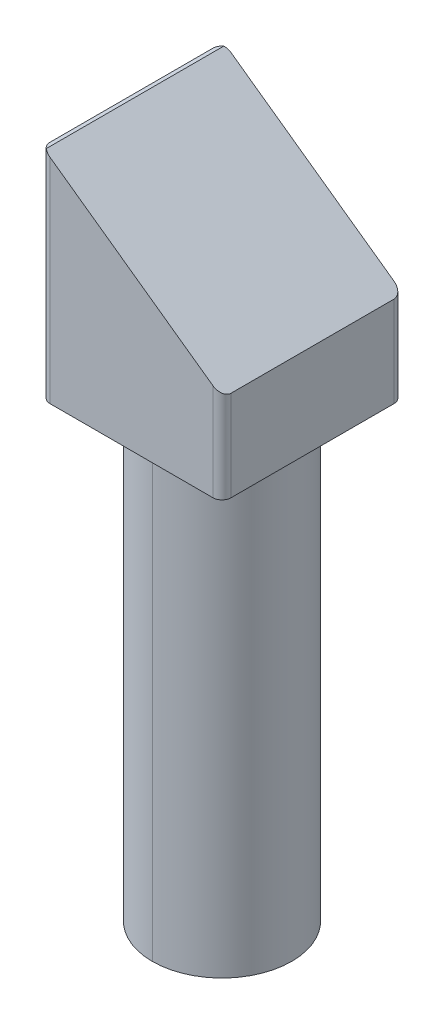
ISO-10303-21;
HEADER;
FILE_DESCRIPTION(('STEP AP214'),'2;1');
FILE_NAME('part.step','',(''),(''),'','','');
FILE_SCHEMA(('AUTOMOTIVE_DESIGN { 1 0 10303 214 1 1 1 1 }'));
ENDSEC;
DATA;
#1=APPLICATION_CONTEXT('core data for automotive mechanical design processes');
#2=APPLICATION_PROTOCOL_DEFINITION('international standard','automotive_design',2000,#1);
#3=PRODUCT_CONTEXT('',#1,'mechanical');
#4=PRODUCT('Part','Part','',(#3));
#5=PRODUCT_RELATED_PRODUCT_CATEGORY('part','',(#4));
#6=PRODUCT_DEFINITION_FORMATION('','',#4);
#7=PRODUCT_DEFINITION_CONTEXT('part definition',#1,'design');
#8=PRODUCT_DEFINITION('design','',#6,#7);
#9=PRODUCT_DEFINITION_SHAPE('','',#8);
#10=(LENGTH_UNIT() NAMED_UNIT(*) SI_UNIT(.MILLI.,.METRE.));
#11=(NAMED_UNIT(*) PLANE_ANGLE_UNIT() SI_UNIT($,.RADIAN.));
#12=(NAMED_UNIT(*) SI_UNIT($,.STERADIAN.) SOLID_ANGLE_UNIT());
#13=UNCERTAINTY_MEASURE_WITH_UNIT(LENGTH_MEASURE(1.E-05),#10,'distance_accuracy_value','');
#14=(GEOMETRIC_REPRESENTATION_CONTEXT(3) GLOBAL_UNCERTAINTY_ASSIGNED_CONTEXT((#13)) GLOBAL_UNIT_ASSIGNED_CONTEXT((#10,
#11,#12)) REPRESENTATION_CONTEXT('',''));
#15=CARTESIAN_POINT('',(0.,0.,0.));
#16=DIRECTION('',(0.,0.,1.));
#17=DIRECTION('',(1.,0.,0.));
#18=AXIS2_PLACEMENT_3D('',#15,#16,#17);
#19=CARTESIAN_POINT('',(0.,12.,0.));
#20=DIRECTION('',(0.,-1.,0.));
#21=DIRECTION('',(0.,0.,-1.));
#22=AXIS2_PLACEMENT_3D('',#19,#20,#21);
#23=PLANE('',#22);
#24=CARTESIAN_POINT('',(-4.5,12.,-4.5));
#25=DIRECTION('',(0.,-1.,0.));
#26=DIRECTION('',(0.,0.,-1.));
#27=AXIS2_PLACEMENT_3D('',#24,#25,#26);
#28=CIRCLE('',#27,0.5);
#29=CARTESIAN_POINT('',(-5.,12.,-4.5));
#30=VERTEX_POINT('',#29);
#31=CARTESIAN_POINT('',(-4.8,12.,-4.9));
#32=VERTEX_POINT('',#31);
#33=EDGE_CURVE('E11',#30,#32,#28,.T.);
#34=ORIENTED_EDGE('',*,*,#33,.F.);
#35=DIRECTION('',(0.,0.,1.));
#36=VECTOR('',#35,1.);
#37=CARTESIAN_POINT('',(-5.,12.,5.));
#38=LINE('',#37,#36);
#39=CARTESIAN_POINT('',(-5.,12.,4.5));
#40=VERTEX_POINT('',#39);
#41=EDGE_CURVE('E161',#30,#40,#38,.T.);
#42=ORIENTED_EDGE('',*,*,#41,.T.);
#43=CARTESIAN_POINT('',(-4.5,12.,4.5));
#44=DIRECTION('',(0.,-1.,0.));
#45=DIRECTION('',(0.,0.,-1.));
#46=AXIS2_PLACEMENT_3D('',#43,#44,#45);
#47=CIRCLE('',#46,0.5);
#48=CARTESIAN_POINT('',(-4.8,12.,4.9));
#49=VERTEX_POINT('',#48);
#50=EDGE_CURVE('E27',#49,#40,#47,.T.);
#51=ORIENTED_EDGE('',*,*,#50,.F.);
#52=DIRECTION('',(0.,0.,-1.));
#53=VECTOR('',#52,1.);
#54=CARTESIAN_POINT('',(-4.8,12.,-7.));
#55=LINE('',#54,#53);
#56=EDGE_CURVE('E219',#49,#32,#55,.T.);
#57=ORIENTED_EDGE('',*,*,#56,.T.);
#58=EDGE_LOOP('',(#34,#42,#51,#57));
#59=FACE_BOUND('',#58,.T.);
#60=ADVANCED_FACE('F16',(#59),#23,.F.);
#61=CARTESIAN_POINT('',(-4.5,12.,-4.5));
#62=DIRECTION('',(0.,-1.,0.));
#63=DIRECTION('',(0.,0.,-1.));
#64=AXIS2_PLACEMENT_3D('',#61,#62,#63);
#65=CYLINDRICAL_SURFACE('',#64,0.5);
#66=DIRECTION('',(0.,1.,0.));
#67=VECTOR('',#66,1.);
#68=CARTESIAN_POINT('',(-5.,12.,-4.5));
#69=LINE('',#68,#67);
#70=CARTESIAN_POINT('',(-5.,0.,-4.5));
#71=VERTEX_POINT('',#70);
#72=EDGE_CURVE('E162',#71,#30,#69,.T.);
#73=ORIENTED_EDGE('',*,*,#72,.T.);
#74=ORIENTED_EDGE('',*,*,#33,.T.);
#75=CARTESIAN_POINT('',(-4.8,12.,-4.9));
#76=CARTESIAN_POINT('',(-4.71268546646672,11.9376324760477,-4.96548590014996));
#77=CARTESIAN_POINT('',(-4.6091431669166,11.8636736906547,-5.));
#78=CARTESIAN_POINT('',(-4.5,11.7857142857143,-5.));
#79=(BOUNDED_CURVE() B_SPLINE_CURVE(3,(#75,#76,#77,#78),.UNSPECIFIED.,.F.,
.F.) B_SPLINE_CURVE_WITH_KNOTS((4,4),(4.06888787159142,4.71238898038469),
.UNSPECIFIED.) CURVE() GEOMETRIC_REPRESENTATION_ITEM() RATIONAL_B_SPLINE_CURVE((1.,
0.96578886536701,0.96578886536701,1.)) REPRESENTATION_ITEM(''));
#80=CARTESIAN_POINT('',(-4.5,11.7857142857143,-5.));
#81=VERTEX_POINT('',#80);
#82=EDGE_CURVE('E206',#32,#81,#79,.T.);
#83=ORIENTED_EDGE('',*,*,#82,.T.);
#84=DIRECTION('',(0.,-1.,0.));
#85=VECTOR('',#84,1.);
#86=CARTESIAN_POINT('',(-4.5,12.,-5.));
#87=LINE('',#86,#85);
#88=CARTESIAN_POINT('',(-4.5,0.,-5.));
#89=VERTEX_POINT('',#88);
#90=EDGE_CURVE('E250',#81,#89,#87,.T.);
#91=ORIENTED_EDGE('',*,*,#90,.T.);
#92=CARTESIAN_POINT('',(-4.5,0.,-4.5));
#93=DIRECTION('',(0.,1.,0.));
#94=DIRECTION('',(0.,0.,-1.));
#95=AXIS2_PLACEMENT_3D('',#92,#93,#94);
#96=CIRCLE('',#95,0.5);
#97=EDGE_CURVE('E172',#89,#71,#96,.T.);
#98=ORIENTED_EDGE('',*,*,#97,.T.);
#99=EDGE_LOOP('',(#73,#74,#83,#91,#98));
#100=FACE_BOUND('',#99,.T.);
#101=ADVANCED_FACE('F424',(#100),#65,.T.);
#102=CARTESIAN_POINT('',(4.5,12.,-4.5));
#103=DIRECTION('',(0.,-1.,0.));
#104=DIRECTION('',(0.,0.,-1.));
#105=AXIS2_PLACEMENT_3D('',#102,#103,#104);
#106=CYLINDRICAL_SURFACE('',#105,0.5);
#107=CARTESIAN_POINT('',(4.5,0.,-4.5));
#108=DIRECTION('',(0.,1.,0.));
#109=DIRECTION('',(0.,0.,-1.));
#110=AXIS2_PLACEMENT_3D('',#107,#108,#109);
#111=CIRCLE('',#110,0.5);
#112=CARTESIAN_POINT('',(5.,0.,-4.5));
#113=VERTEX_POINT('',#112);
#114=CARTESIAN_POINT('',(4.5,0.,-5.));
#115=VERTEX_POINT('',#114);
#116=EDGE_CURVE('E259',#113,#115,#111,.T.);
#117=ORIENTED_EDGE('',*,*,#116,.T.);
#118=DIRECTION('',(0.,1.,0.));
#119=VECTOR('',#118,1.);
#120=CARTESIAN_POINT('',(4.5,12.,-5.));
#121=LINE('',#120,#119);
#122=CARTESIAN_POINT('',(4.5,5.35714285714286,-5.));
#123=VERTEX_POINT('',#122);
#124=EDGE_CURVE('E256',#115,#123,#121,.T.);
#125=ORIENTED_EDGE('',*,*,#124,.T.);
#126=CARTESIAN_POINT('',(4.5,5.35714285714286,-5.));
#127=CARTESIAN_POINT('',(4.79289321881345,5.14793341513324,-5.));
#128=CARTESIAN_POINT('',(5.,5.,-4.79289321881345));
#129=CARTESIAN_POINT('',(5.,5.,-4.5));
#130=(BOUNDED_CURVE() B_SPLINE_CURVE(3,(#126,#127,#128,#129),.UNSPECIFIED.,.F.,
.F.) B_SPLINE_CURVE_WITH_KNOTS((4,4),(4.71238898038469,6.28318530717958),
.UNSPECIFIED.) CURVE() GEOMETRIC_REPRESENTATION_ITEM() RATIONAL_B_SPLINE_CURVE((1.,
0.804737854124365,0.804737854124365,1.)) REPRESENTATION_ITEM(''));
#131=CARTESIAN_POINT('',(5.,5.,-4.5));
#132=VERTEX_POINT('',#131);
#133=EDGE_CURVE('E189',#123,#132,#130,.T.);
#134=ORIENTED_EDGE('',*,*,#133,.T.);
#135=DIRECTION('',(0.,-1.,0.));
#136=VECTOR('',#135,1.);
#137=CARTESIAN_POINT('',(5.,12.,-4.5));
#138=LINE('',#137,#136);
#139=EDGE_CURVE('E194',#132,#113,#138,.T.);
#140=ORIENTED_EDGE('',*,*,#139,.T.);
#141=EDGE_LOOP('',(#117,#125,#134,#140));
#142=FACE_BOUND('',#141,.T.);
#143=ADVANCED_FACE('F328',(#142),#106,.T.);
#144=CARTESIAN_POINT('',(-4.5,12.,4.5));
#145=DIRECTION('',(0.,-1.,0.));
#146=DIRECTION('',(0.,0.,-1.));
#147=AXIS2_PLACEMENT_3D('',#144,#145,#146);
#148=CYLINDRICAL_SURFACE('',#147,0.5);
#149=DIRECTION('',(0.,1.,0.));
#150=VECTOR('',#149,1.);
#151=CARTESIAN_POINT('',(-4.5,12.,5.));
#152=LINE('',#151,#150);
#153=CARTESIAN_POINT('',(-4.5,0.,5.));
#154=VERTEX_POINT('',#153);
#155=CARTESIAN_POINT('',(-4.5,11.7857142857143,5.));
#156=VERTEX_POINT('',#155);
#157=EDGE_CURVE('E198',#154,#156,#152,.T.);
#158=ORIENTED_EDGE('',*,*,#157,.T.);
#159=CARTESIAN_POINT('',(-4.5,11.7857142857143,5.));
#160=CARTESIAN_POINT('',(-4.6091431669166,11.8636736906547,5.));
#161=CARTESIAN_POINT('',(-4.71268546646672,11.9376324760477,4.96548590014996));
#162=CARTESIAN_POINT('',(-4.8,12.,4.9));
#163=(BOUNDED_CURVE() B_SPLINE_CURVE(3,(#159,#160,#161,#162),.UNSPECIFIED.,.F.,
.F.) B_SPLINE_CURVE_WITH_KNOTS((4,4),(1.5707963267949,2.21429743558817),
.UNSPECIFIED.) CURVE() GEOMETRIC_REPRESENTATION_ITEM() RATIONAL_B_SPLINE_CURVE((1.,
0.96578886536701,0.96578886536701,1.)) REPRESENTATION_ITEM(''));
#164=EDGE_CURVE('E299',#156,#49,#163,.T.);
#165=ORIENTED_EDGE('',*,*,#164,.T.);
#166=ORIENTED_EDGE('',*,*,#50,.T.);
#167=DIRECTION('',(0.,-1.,0.));
#168=VECTOR('',#167,1.);
#169=CARTESIAN_POINT('',(-5.,12.,4.5));
#170=LINE('',#169,#168);
#171=CARTESIAN_POINT('',(-5.,0.,4.5));
#172=VERTEX_POINT('',#171);
#173=EDGE_CURVE('E151',#40,#172,#170,.T.);
#174=ORIENTED_EDGE('',*,*,#173,.T.);
#175=CARTESIAN_POINT('',(-4.5,0.,4.5));
#176=DIRECTION('',(0.,1.,0.));
#177=DIRECTION('',(0.,0.,-1.));
#178=AXIS2_PLACEMENT_3D('',#175,#176,#177);
#179=CIRCLE('',#178,0.5);
#180=EDGE_CURVE('E156',#172,#154,#179,.T.);
#181=ORIENTED_EDGE('',*,*,#180,.T.);
#182=EDGE_LOOP('',(#158,#165,#166,#174,#181));
#183=FACE_BOUND('',#182,.T.);
#184=ADVANCED_FACE('F154',(#183),#148,.T.);
#185=CARTESIAN_POINT('',(5.,5.,-7.));
#186=DIRECTION('',(-0.581238193719097,-0.813733471206735,0.));
#187=DIRECTION('',(-0.813733471206735,0.581238193719097,0.));
#188=AXIS2_PLACEMENT_3D('',#185,#186,#187);
#189=PLANE('',#188);
#190=ORIENTED_EDGE('',*,*,#82,.F.);
#191=ORIENTED_EDGE('',*,*,#56,.F.);
#192=ORIENTED_EDGE('',*,*,#164,.F.);
#193=DIRECTION('',(0.813733471206735,-0.581238193719096,0.));
#194=VECTOR('',#193,1.);
#195=CARTESIAN_POINT('',(-4.5,11.7857142857143,5.));
#196=LINE('',#195,#194);
#197=CARTESIAN_POINT('',(4.5,5.35714285714286,5.));
#198=VERTEX_POINT('',#197);
#199=EDGE_CURVE('E207',#156,#198,#196,.T.);
#200=ORIENTED_EDGE('',*,*,#199,.T.);
#201=CARTESIAN_POINT('',(5.,5.,4.5));
#202=CARTESIAN_POINT('',(5.,5.,4.79289321881345));
#203=CARTESIAN_POINT('',(4.79289321881345,5.14793341513324,5.));
#204=CARTESIAN_POINT('',(4.5,5.35714285714286,5.));
#205=(BOUNDED_CURVE() B_SPLINE_CURVE(3,(#201,#202,#203,#204),.UNSPECIFIED.,.F.,
.F.) B_SPLINE_CURVE_WITH_KNOTS((4,4),(0.,1.5707963267949),
.UNSPECIFIED.) CURVE() GEOMETRIC_REPRESENTATION_ITEM() RATIONAL_B_SPLINE_CURVE((1.,
0.804737854124365,0.804737854124365,1.)) REPRESENTATION_ITEM(''));
#206=CARTESIAN_POINT('',(5.,5.,4.5));
#207=VERTEX_POINT('',#206);
#208=EDGE_CURVE('E201',#207,#198,#205,.T.);
#209=ORIENTED_EDGE('',*,*,#208,.F.);
#210=DIRECTION('',(0.,0.,-1.));
#211=VECTOR('',#210,1.);
#212=CARTESIAN_POINT('',(5.,5.,5.));
#213=LINE('',#212,#211);
#214=EDGE_CURVE('E197',#207,#132,#213,.T.);
#215=ORIENTED_EDGE('',*,*,#214,.T.);
#216=ORIENTED_EDGE('',*,*,#133,.F.);
#217=DIRECTION('',(-0.813733471206735,0.581238193719096,0.));
#218=VECTOR('',#217,1.);
#219=CARTESIAN_POINT('',(4.5,5.35714285714286,-5.));
#220=LINE('',#219,#218);
#221=EDGE_CURVE('E254',#123,#81,#220,.T.);
#222=ORIENTED_EDGE('',*,*,#221,.T.);
#223=EDGE_LOOP('',(#190,#191,#192,#200,#209,#215,#216,#222));
#224=FACE_BOUND('',#223,.T.);
#225=ADVANCED_FACE('F406',(#224),#189,.F.);
#226=CARTESIAN_POINT('',(4.5,12.,4.5));
#227=DIRECTION('',(0.,-1.,0.));
#228=DIRECTION('',(0.,0.,-1.));
#229=AXIS2_PLACEMENT_3D('',#226,#227,#228);
#230=CYLINDRICAL_SURFACE('',#229,0.5);
#231=CARTESIAN_POINT('',(4.5,0.,4.5));
#232=DIRECTION('',(0.,1.,0.));
#233=DIRECTION('',(0.,0.,-1.));
#234=AXIS2_PLACEMENT_3D('',#231,#232,#233);
#235=CIRCLE('',#234,0.5);
#236=CARTESIAN_POINT('',(4.5,0.,5.));
#237=VERTEX_POINT('',#236);
#238=CARTESIAN_POINT('',(5.,0.,4.5));
#239=VERTEX_POINT('',#238);
#240=EDGE_CURVE('E272',#237,#239,#235,.T.);
#241=ORIENTED_EDGE('',*,*,#240,.T.);
#242=DIRECTION('',(0.,1.,0.));
#243=VECTOR('',#242,1.);
#244=CARTESIAN_POINT('',(5.,12.,4.5));
#245=LINE('',#244,#243);
#246=EDGE_CURVE('E255',#239,#207,#245,.T.);
#247=ORIENTED_EDGE('',*,*,#246,.T.);
#248=ORIENTED_EDGE('',*,*,#208,.T.);
#249=DIRECTION('',(0.,-1.,0.));
#250=VECTOR('',#249,1.);
#251=CARTESIAN_POINT('',(4.5,12.,5.));
#252=LINE('',#251,#250);
#253=EDGE_CURVE('E214',#198,#237,#252,.T.);
#254=ORIENTED_EDGE('',*,*,#253,.T.);
#255=EDGE_LOOP('',(#241,#247,#248,#254));
#256=FACE_BOUND('',#255,.T.);
#257=ADVANCED_FACE('F324',(#256),#230,.T.);
#258=CARTESIAN_POINT('',(-5.,12.,5.));
#259=DIRECTION('',(1.,0.,0.));
#260=DIRECTION('',(0.,1.,0.));
#261=AXIS2_PLACEMENT_3D('',#258,#259,#260);
#262=PLANE('',#261);
#263=ORIENTED_EDGE('',*,*,#72,.F.);
#264=DIRECTION('',(0.,0.,-1.));
#265=VECTOR('',#264,1.);
#266=CARTESIAN_POINT('',(-5.,0.,0.));
#267=LINE('',#266,#265);
#268=EDGE_CURVE('E165',#172,#71,#267,.T.);
#269=ORIENTED_EDGE('',*,*,#268,.F.);
#270=ORIENTED_EDGE('',*,*,#173,.F.);
#271=ORIENTED_EDGE('',*,*,#41,.F.);
#272=EDGE_LOOP('',(#263,#269,#270,#271));
#273=FACE_BOUND('',#272,.T.);
#274=ADVANCED_FACE('F166',(#273),#262,.F.);
#275=CARTESIAN_POINT('',(-5.,12.,-5.));
#276=DIRECTION('',(0.,0.,1.));
#277=DIRECTION('',(1.,0.,0.));
#278=AXIS2_PLACEMENT_3D('',#275,#276,#277);
#279=PLANE('',#278);
#280=ORIENTED_EDGE('',*,*,#90,.F.);
#281=ORIENTED_EDGE('',*,*,#221,.F.);
#282=ORIENTED_EDGE('',*,*,#124,.F.);
#283=DIRECTION('',(1.,0.,0.));
#284=VECTOR('',#283,1.);
#285=CARTESIAN_POINT('',(0.,0.,-5.));
#286=LINE('',#285,#284);
#287=EDGE_CURVE('E263',#89,#115,#286,.T.);
#288=ORIENTED_EDGE('',*,*,#287,.F.);
#289=EDGE_LOOP('',(#280,#281,#282,#288));
#290=FACE_BOUND('',#289,.T.);
#291=ADVANCED_FACE('F436',(#290),#279,.F.);
#292=CARTESIAN_POINT('',(5.,12.,5.));
#293=DIRECTION('',(-1.,0.,0.));
#294=DIRECTION('',(0.,0.,1.));
#295=AXIS2_PLACEMENT_3D('',#292,#293,#294);
#296=PLANE('',#295);
#297=ORIENTED_EDGE('',*,*,#139,.F.);
#298=ORIENTED_EDGE('',*,*,#214,.F.);
#299=ORIENTED_EDGE('',*,*,#246,.F.);
#300=DIRECTION('',(0.,0.,1.));
#301=VECTOR('',#300,1.);
#302=CARTESIAN_POINT('',(5.,0.,0.));
#303=LINE('',#302,#301);
#304=EDGE_CURVE('E262',#113,#239,#303,.T.);
#305=ORIENTED_EDGE('',*,*,#304,.F.);
#306=EDGE_LOOP('',(#297,#298,#299,#305));
#307=FACE_BOUND('',#306,.T.);
#308=ADVANCED_FACE('F327',(#307),#296,.F.);
#309=CARTESIAN_POINT('',(-5.,12.,5.));
#310=DIRECTION('',(0.,0.,-1.));
#311=DIRECTION('',(0.,-1.,0.));
#312=AXIS2_PLACEMENT_3D('',#309,#310,#311);
#313=PLANE('',#312);
#314=ORIENTED_EDGE('',*,*,#253,.F.);
#315=ORIENTED_EDGE('',*,*,#199,.F.);
#316=ORIENTED_EDGE('',*,*,#157,.F.);
#317=DIRECTION('',(-1.,0.,0.));
#318=VECTOR('',#317,1.);
#319=CARTESIAN_POINT('',(0.,0.,5.));
#320=LINE('',#319,#318);
#321=EDGE_CURVE('E177',#237,#154,#320,.T.);
#322=ORIENTED_EDGE('',*,*,#321,.F.);
#323=EDGE_LOOP('',(#314,#315,#316,#322));
#324=FACE_BOUND('',#323,.T.);
#325=ADVANCED_FACE('F418',(#324),#313,.F.);
#326=CARTESIAN_POINT('',(0.,0.,0.));
#327=DIRECTION('',(0.,-1.,0.));
#328=DIRECTION('',(0.,0.,-1.));
#329=AXIS2_PLACEMENT_3D('',#326,#327,#328);
#330=PLANE('',#329);
#331=CARTESIAN_POINT('',(0.,0.,0.));
#332=DIRECTION('',(0.,-1.,0.));
#333=DIRECTION('',(0.,0.,1.));
#334=AXIS2_PLACEMENT_3D('',#331,#332,#333);
#335=CIRCLE('',#334,3.);
#336=CARTESIAN_POINT('',(0.,0.,3.));
#337=VERTEX_POINT('',#336);
#338=CARTESIAN_POINT('',(0.,0.,-3.));
#339=VERTEX_POINT('',#338);
#340=EDGE_CURVE('E185',#337,#339,#335,.T.);
#341=ORIENTED_EDGE('',*,*,#340,.F.);
#342=CARTESIAN_POINT('',(0.,0.,0.));
#343=DIRECTION('',(0.,-1.,0.));
#344=DIRECTION('',(0.,0.,1.));
#345=AXIS2_PLACEMENT_3D('',#342,#343,#344);
#346=CIRCLE('',#345,3.);
#347=EDGE_CURVE('E20',#339,#337,#346,.T.);
#348=ORIENTED_EDGE('',*,*,#347,.F.);
#349=EDGE_LOOP('',(#341,#348));
#350=FACE_BOUND('',#349,.T.);
#351=ORIENTED_EDGE('',*,*,#321,.T.);
#352=ORIENTED_EDGE('',*,*,#180,.F.);
#353=ORIENTED_EDGE('',*,*,#268,.T.);
#354=ORIENTED_EDGE('',*,*,#97,.F.);
#355=ORIENTED_EDGE('',*,*,#287,.T.);
#356=ORIENTED_EDGE('',*,*,#116,.F.);
#357=ORIENTED_EDGE('',*,*,#304,.T.);
#358=ORIENTED_EDGE('',*,*,#240,.F.);
#359=EDGE_LOOP('',(#351,#352,#353,#354,#355,#356,#357,#358));
#360=FACE_BOUND('',#359,.T.);
#361=ADVANCED_FACE('F174',(#350,#360),#330,.T.);
#362=CARTESIAN_POINT('',(0.,-1.,0.));
#363=DIRECTION('',(0.,1.,0.));
#364=DIRECTION('',(0.,0.,1.));
#365=AXIS2_PLACEMENT_3D('',#362,#363,#364);
#366=CYLINDRICAL_SURFACE('',#365,3.);
#367=DIRECTION('',(0.,1.,0.));
#368=VECTOR('',#367,1.);
#369=CARTESIAN_POINT('',(0.,-1.,-3.));
#370=LINE('',#369,#368);
#371=CARTESIAN_POINT('',(0.,-1.,-3.));
#372=VERTEX_POINT('',#371);
#373=EDGE_CURVE('E227',#372,#339,#370,.T.);
#374=ORIENTED_EDGE('',*,*,#373,.F.);
#375=CARTESIAN_POINT('',(0.,-1.,0.));
#376=DIRECTION('',(0.,1.,0.));
#377=DIRECTION('',(0.,0.,1.));
#378=AXIS2_PLACEMENT_3D('',#375,#376,#377);
#379=CIRCLE('',#378,3.);
#380=CARTESIAN_POINT('',(0.,-1.,3.));
#381=VERTEX_POINT('',#380);
#382=EDGE_CURVE('E311',#372,#381,#379,.T.);
#383=ORIENTED_EDGE('',*,*,#382,.T.);
#384=DIRECTION('',(0.,1.,0.));
#385=VECTOR('',#384,1.);
#386=CARTESIAN_POINT('',(0.,-1.,3.));
#387=LINE('',#386,#385);
#388=EDGE_CURVE('E243',#381,#337,#387,.T.);
#389=ORIENTED_EDGE('',*,*,#388,.T.);
#390=ORIENTED_EDGE('',*,*,#340,.T.);
#391=EDGE_LOOP('',(#374,#383,#389,#390));
#392=FACE_BOUND('',#391,.T.);
#393=ADVANCED_FACE('F417',(#392),#366,.T.);
#394=CARTESIAN_POINT('',(0.,-25.,0.));
#395=DIRECTION('',(0.,-1.,0.));
#396=DIRECTION('',(0.,0.,-1.));
#397=AXIS2_PLACEMENT_3D('',#394,#395,#396);
#398=PLANE('',#397);
#399=CARTESIAN_POINT('',(0.,-25.,0.));
#400=DIRECTION('',(0.,1.,0.));
#401=DIRECTION('',(0.,0.,1.));
#402=AXIS2_PLACEMENT_3D('',#399,#400,#401);
#403=CIRCLE('',#402,3.85);
#404=CARTESIAN_POINT('',(0.,-25.,3.85));
#405=VERTEX_POINT('',#404);
#406=CARTESIAN_POINT('',(0.,-25.,-3.85));
#407=VERTEX_POINT('',#406);
#408=EDGE_CURVE('E237',#405,#407,#403,.T.);
#409=ORIENTED_EDGE('',*,*,#408,.F.);
#410=CARTESIAN_POINT('',(0.,-25.,0.));
#411=DIRECTION('',(0.,1.,0.));
#412=DIRECTION('',(0.,0.,1.));
#413=AXIS2_PLACEMENT_3D('',#410,#411,#412);
#414=CIRCLE('',#413,3.85);
#415=EDGE_CURVE('E116',#407,#405,#414,.T.);
#416=ORIENTED_EDGE('',*,*,#415,.F.);
#417=EDGE_LOOP('',(#409,#416));
#418=FACE_BOUND('',#417,.T.);
#419=ADVANCED_FACE('F446',(#418),#398,.T.);
#420=CARTESIAN_POINT('',(0.,-1.,0.));
#421=DIRECTION('',(0.,-1.,0.));
#422=DIRECTION('',(0.,0.,-1.));
#423=AXIS2_PLACEMENT_3D('',#420,#421,#422);
#424=PLANE('',#423);
#425=CARTESIAN_POINT('',(0.,-1.,0.));
#426=DIRECTION('',(0.,1.,0.));
#427=DIRECTION('',(0.,0.,1.));
#428=AXIS2_PLACEMENT_3D('',#425,#426,#427);
#429=CIRCLE('',#428,3.);
#430=EDGE_CURVE('E220',#381,#372,#429,.T.);
#431=ORIENTED_EDGE('',*,*,#430,.F.);
#432=ORIENTED_EDGE('',*,*,#382,.F.);
#433=EDGE_LOOP('',(#431,#432));
#434=FACE_BOUND('',#433,.T.);
#435=CARTESIAN_POINT('',(0.,-1.,0.));
#436=DIRECTION('',(0.,-1.,0.));
#437=DIRECTION('',(0.,0.,1.));
#438=AXIS2_PLACEMENT_3D('',#435,#436,#437);
#439=CIRCLE('',#438,3.85);
#440=CARTESIAN_POINT('',(0.,-1.,3.85));
#441=VERTEX_POINT('',#440);
#442=CARTESIAN_POINT('',(0.,-1.,-3.85));
#443=VERTEX_POINT('',#442);
#444=EDGE_CURVE('E248',#441,#443,#439,.T.);
#445=ORIENTED_EDGE('',*,*,#444,.F.);
#446=CARTESIAN_POINT('',(0.,-1.,0.));
#447=DIRECTION('',(0.,-1.,0.));
#448=DIRECTION('',(0.,0.,1.));
#449=AXIS2_PLACEMENT_3D('',#446,#447,#448);
#450=CIRCLE('',#449,3.85);
#451=EDGE_CURVE('E229',#443,#441,#450,.T.);
#452=ORIENTED_EDGE('',*,*,#451,.F.);
#453=EDGE_LOOP('',(#445,#452));
#454=FACE_BOUND('',#453,.T.);
#455=ADVANCED_FACE('F441',(#434,#454),#424,.F.);
#456=CARTESIAN_POINT('',(0.,-25.,0.));
#457=DIRECTION('',(0.,1.,0.));
#458=DIRECTION('',(0.,0.,1.));
#459=AXIS2_PLACEMENT_3D('',#456,#457,#458);
#460=CYLINDRICAL_SURFACE('',#459,3.85);
#461=DIRECTION('',(0.,1.,0.));
#462=VECTOR('',#461,1.);
#463=CARTESIAN_POINT('',(0.,-25.,-3.85));
#464=LINE('',#463,#462);
#465=EDGE_CURVE('E233',#407,#443,#464,.T.);
#466=ORIENTED_EDGE('',*,*,#465,.F.);
#467=ORIENTED_EDGE('',*,*,#415,.T.);
#468=DIRECTION('',(0.,1.,0.));
#469=VECTOR('',#468,1.);
#470=CARTESIAN_POINT('',(0.,-25.,3.85));
#471=LINE('',#470,#469);
#472=EDGE_CURVE('E228',#405,#441,#471,.T.);
#473=ORIENTED_EDGE('',*,*,#472,.T.);
#474=ORIENTED_EDGE('',*,*,#444,.T.);
#475=EDGE_LOOP('',(#466,#467,#473,#474));
#476=FACE_BOUND('',#475,.T.);
#477=ADVANCED_FACE('F445',(#476),#460,.T.);
#478=CARTESIAN_POINT('',(0.,-1.,0.));
#479=DIRECTION('',(0.,1.,0.));
#480=DIRECTION('',(0.,0.,1.));
#481=AXIS2_PLACEMENT_3D('',#478,#479,#480);
#482=CYLINDRICAL_SURFACE('',#481,3.);
#483=ORIENTED_EDGE('',*,*,#430,.T.);
#484=ORIENTED_EDGE('',*,*,#373,.T.);
#485=ORIENTED_EDGE('',*,*,#347,.T.);
#486=ORIENTED_EDGE('',*,*,#388,.F.);
#487=EDGE_LOOP('',(#483,#484,#485,#486));
#488=FACE_BOUND('',#487,.T.);
#489=ADVANCED_FACE('F18',(#488),#482,.T.);
#490=CARTESIAN_POINT('',(0.,-25.,0.));
#491=DIRECTION('',(0.,1.,0.));
#492=DIRECTION('',(0.,0.,1.));
#493=AXIS2_PLACEMENT_3D('',#490,#491,#492);
#494=CYLINDRICAL_SURFACE('',#493,3.85);
#495=ORIENTED_EDGE('',*,*,#408,.T.);
#496=ORIENTED_EDGE('',*,*,#465,.T.);
#497=ORIENTED_EDGE('',*,*,#451,.T.);
#498=ORIENTED_EDGE('',*,*,#472,.F.);
#499=EDGE_LOOP('',(#495,#496,#497,#498));
#500=FACE_BOUND('',#499,.T.);
#501=ADVANCED_FACE('F397',(#500),#494,.T.);
#502=CLOSED_SHELL('',(#60,#101,#143,#184,#225,#257,#274,#291,#308,#325,#361,#393,#419,#455,#477,
#489,#501));
#503=MANIFOLD_SOLID_BREP('B1',#502);
#504=ADVANCED_BREP_SHAPE_REPRESENTATION('',(#18,#503),#14);
#505=SHAPE_DEFINITION_REPRESENTATION(#9,#504);
ENDSEC;
END-ISO-10303-21;
